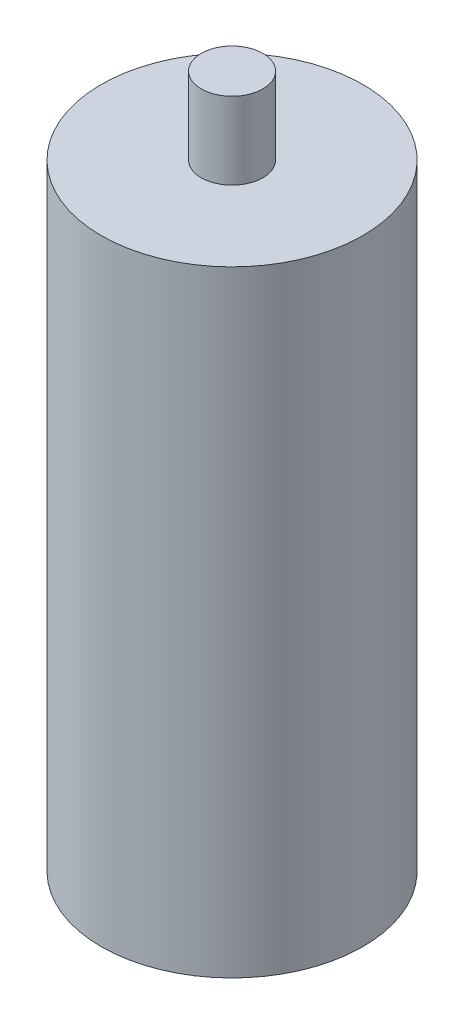
ISO-10303-21;
HEADER;
FILE_DESCRIPTION(('STEP AP214'),'2;1');
FILE_NAME('part.step','',(''),(''),'','','');
FILE_SCHEMA(('AUTOMOTIVE_DESIGN { 1 0 10303 214 1 1 1 1 }'));
ENDSEC;
DATA;
#1=APPLICATION_CONTEXT('core data for automotive mechanical design processes');
#2=APPLICATION_PROTOCOL_DEFINITION('international standard','automotive_design',2000,#1);
#3=PRODUCT_CONTEXT('',#1,'mechanical');
#4=PRODUCT('Part','Part','',(#3));
#5=PRODUCT_RELATED_PRODUCT_CATEGORY('part','',(#4));
#6=PRODUCT_DEFINITION_FORMATION('','',#4);
#7=PRODUCT_DEFINITION_CONTEXT('part definition',#1,'design');
#8=PRODUCT_DEFINITION('design','',#6,#7);
#9=PRODUCT_DEFINITION_SHAPE('','',#8);
#10=(LENGTH_UNIT() NAMED_UNIT(*) SI_UNIT(.MILLI.,.METRE.));
#11=(NAMED_UNIT(*) PLANE_ANGLE_UNIT() SI_UNIT($,.RADIAN.));
#12=(NAMED_UNIT(*) SI_UNIT($,.STERADIAN.) SOLID_ANGLE_UNIT());
#13=UNCERTAINTY_MEASURE_WITH_UNIT(LENGTH_MEASURE(1.E-05),#10,'distance_accuracy_value','');
#14=(GEOMETRIC_REPRESENTATION_CONTEXT(3) GLOBAL_UNCERTAINTY_ASSIGNED_CONTEXT((#13)) GLOBAL_UNIT_ASSIGNED_CONTEXT((#10,
#11,#12)) REPRESENTATION_CONTEXT('',''));
#15=CARTESIAN_POINT('',(0.,0.,0.));
#16=DIRECTION('',(0.,0.,1.));
#17=DIRECTION('',(1.,0.,0.));
#18=AXIS2_PLACEMENT_3D('',#15,#16,#17);
#19=CARTESIAN_POINT('',(0.,80.,0.));
#20=DIRECTION('',(0.,-1.,0.));
#21=DIRECTION('',(0.,0.,-1.));
#22=AXIS2_PLACEMENT_3D('',#19,#20,#21);
#23=CYLINDRICAL_SURFACE('',#22,17.);
#24=CARTESIAN_POINT('',(0.,80.,0.));
#25=DIRECTION('',(0.,1.,0.));
#26=DIRECTION('',(0.,0.,1.));
#27=AXIS2_PLACEMENT_3D('',#24,#25,#26);
#28=CIRCLE('',#27,17.);
#29=CARTESIAN_POINT('',(0.,80.,17.));
#30=VERTEX_POINT('',#29);
#31=EDGE_CURVE('E38',#30,#30,#28,.T.);
#32=ORIENTED_EDGE('',*,*,#31,.F.);
#33=EDGE_LOOP('',(#32));
#34=FACE_BOUND('',#33,.T.);
#35=CARTESIAN_POINT('',(0.,0.,0.));
#36=DIRECTION('',(0.,1.,0.));
#37=DIRECTION('',(0.,0.,1.));
#38=AXIS2_PLACEMENT_3D('',#35,#36,#37);
#39=CIRCLE('',#38,17.);
#40=CARTESIAN_POINT('',(0.,0.,17.));
#41=VERTEX_POINT('',#40);
#42=EDGE_CURVE('E34',#41,#41,#39,.T.);
#43=ORIENTED_EDGE('',*,*,#42,.T.);
#44=EDGE_LOOP('',(#43));
#45=FACE_BOUND('',#44,.T.);
#46=ADVANCED_FACE('F31',(#34,#45),#23,.T.);
#47=CARTESIAN_POINT('',(0.,80.,0.));
#48=DIRECTION('',(0.,1.,0.));
#49=DIRECTION('',(0.,0.,1.));
#50=AXIS2_PLACEMENT_3D('',#47,#48,#49);
#51=PLANE('',#50);
#52=CARTESIAN_POINT('',(0.,80.,0.));
#53=DIRECTION('',(0.,1.,0.));
#54=DIRECTION('',(0.,0.,1.));
#55=AXIS2_PLACEMENT_3D('',#52,#53,#54);
#56=CIRCLE('',#55,4.);
#57=CARTESIAN_POINT('',(0.,80.,4.));
#58=VERTEX_POINT('',#57);
#59=EDGE_CURVE('E10',#58,#58,#56,.T.);
#60=ORIENTED_EDGE('',*,*,#59,.F.);
#61=EDGE_LOOP('',(#60));
#62=FACE_BOUND('',#61,.T.);
#63=ORIENTED_EDGE('',*,*,#31,.T.);
#64=EDGE_LOOP('',(#63));
#65=FACE_BOUND('',#64,.T.);
#66=ADVANCED_FACE('F55',(#62,#65),#51,.T.);
#67=CARTESIAN_POINT('',(0.,0.,0.));
#68=DIRECTION('',(0.,1.,0.));
#69=DIRECTION('',(0.,0.,1.));
#70=AXIS2_PLACEMENT_3D('',#67,#68,#69);
#71=PLANE('',#70);
#72=ORIENTED_EDGE('',*,*,#42,.F.);
#73=EDGE_LOOP('',(#72));
#74=FACE_BOUND('',#73,.T.);
#75=ADVANCED_FACE('F52',(#74),#71,.F.);
#76=CARTESIAN_POINT('',(0.,90.,0.));
#77=DIRECTION('',(0.,-1.,0.));
#78=DIRECTION('',(0.,0.,-1.));
#79=AXIS2_PLACEMENT_3D('',#76,#77,#78);
#80=CYLINDRICAL_SURFACE('',#79,4.);
#81=CARTESIAN_POINT('',(0.,90.,0.));
#82=DIRECTION('',(0.,1.,0.));
#83=DIRECTION('',(0.,0.,1.));
#84=AXIS2_PLACEMENT_3D('',#81,#82,#83);
#85=CIRCLE('',#84,4.);
#86=CARTESIAN_POINT('',(0.,90.,4.));
#87=VERTEX_POINT('',#86);
#88=EDGE_CURVE('E44',#87,#87,#85,.T.);
#89=ORIENTED_EDGE('',*,*,#88,.F.);
#90=EDGE_LOOP('',(#89));
#91=FACE_BOUND('',#90,.T.);
#92=ORIENTED_EDGE('',*,*,#59,.T.);
#93=EDGE_LOOP('',(#92));
#94=FACE_BOUND('',#93,.T.);
#95=ADVANCED_FACE('F54',(#91,#94),#80,.T.);
#96=CARTESIAN_POINT('',(0.,90.,0.));
#97=DIRECTION('',(0.,1.,0.));
#98=DIRECTION('',(0.,0.,1.));
#99=AXIS2_PLACEMENT_3D('',#96,#97,#98);
#100=PLANE('',#99);
#101=ORIENTED_EDGE('',*,*,#88,.T.);
#102=EDGE_LOOP('',(#101));
#103=FACE_BOUND('',#102,.T.);
#104=ADVANCED_FACE('F60',(#103),#100,.T.);
#105=CLOSED_SHELL('',(#46,#66,#75,#95,#104));
#106=MANIFOLD_SOLID_BREP('B2',#105);
#107=ADVANCED_BREP_SHAPE_REPRESENTATION('',(#18,#106),#14);
#108=SHAPE_DEFINITION_REPRESENTATION(#9,#107);
ENDSEC;
END-ISO-10303-21;
